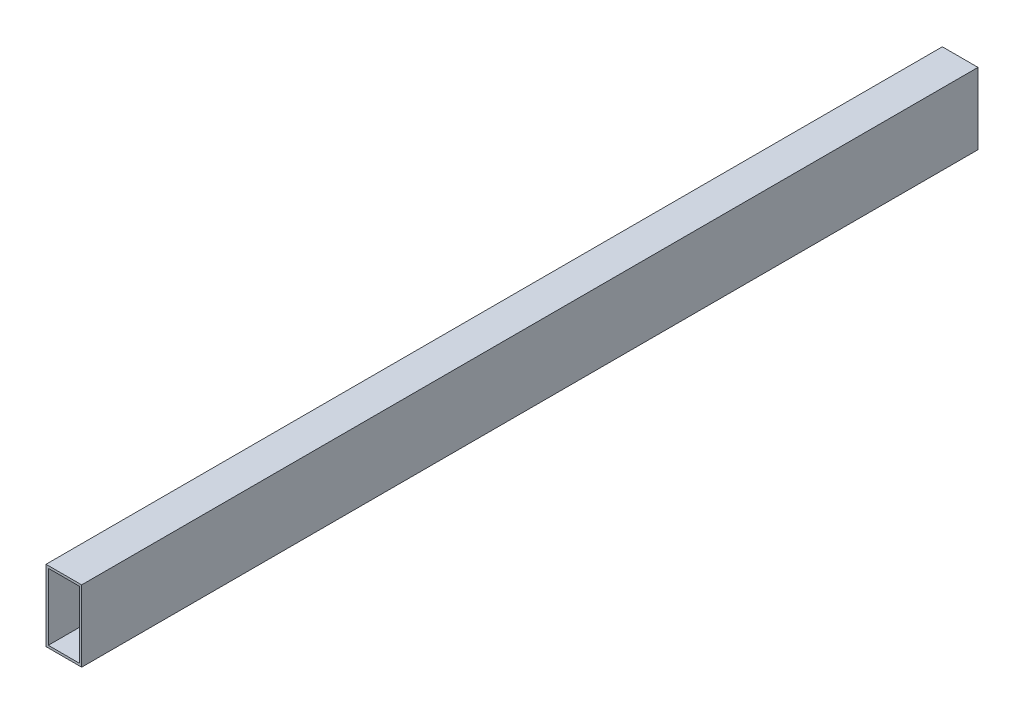
ISO-10303-21;
HEADER;
FILE_DESCRIPTION(('STEP AP214'),'2;1');
FILE_NAME('part.step','',(''),(''),'','','');
FILE_SCHEMA(('AUTOMOTIVE_DESIGN { 1 0 10303 214 1 1 1 1 }'));
ENDSEC;
DATA;
#1=APPLICATION_CONTEXT('core data for automotive mechanical design processes');
#2=APPLICATION_PROTOCOL_DEFINITION('international standard','automotive_design',2000,#1);
#3=PRODUCT_CONTEXT('',#1,'mechanical');
#4=PRODUCT('Part','Part','',(#3));
#5=PRODUCT_RELATED_PRODUCT_CATEGORY('part','',(#4));
#6=PRODUCT_DEFINITION_FORMATION('','',#4);
#7=PRODUCT_DEFINITION_CONTEXT('part definition',#1,'design');
#8=PRODUCT_DEFINITION('design','',#6,#7);
#9=PRODUCT_DEFINITION_SHAPE('','',#8);
#10=(LENGTH_UNIT() NAMED_UNIT(*) SI_UNIT(.MILLI.,.METRE.));
#11=(NAMED_UNIT(*) PLANE_ANGLE_UNIT() SI_UNIT($,.RADIAN.));
#12=(NAMED_UNIT(*) SI_UNIT($,.STERADIAN.) SOLID_ANGLE_UNIT());
#13=UNCERTAINTY_MEASURE_WITH_UNIT(LENGTH_MEASURE(1.E-05),#10,'distance_accuracy_value','');
#14=(GEOMETRIC_REPRESENTATION_CONTEXT(3) GLOBAL_UNCERTAINTY_ASSIGNED_CONTEXT((#13)) GLOBAL_UNIT_ASSIGNED_CONTEXT((#10,
#11,#12)) REPRESENTATION_CONTEXT('',''));
#15=CARTESIAN_POINT('',(0.,0.,0.));
#16=DIRECTION('',(0.,0.,1.));
#17=DIRECTION('',(1.,0.,0.));
#18=AXIS2_PLACEMENT_3D('',#15,#16,#17);
#19=CARTESIAN_POINT('',(-48.4372093023255,-30.1994186046511,638.302));
#20=DIRECTION('',(1.,0.,0.));
#21=DIRECTION('',(0.,0.,-1.));
#22=AXIS2_PLACEMENT_3D('',#19,#20,#21);
#23=PLANE('',#22);
#24=DIRECTION('',(0.,-1.,0.));
#25=VECTOR('',#24,1.);
#26=CARTESIAN_POINT('',(-48.4372093023255,-30.1994186046511,0.));
#27=LINE('',#26,#25);
#28=CARTESIAN_POINT('',(-48.4372093023255,20.6005813953489,0.));
#29=VERTEX_POINT('',#28);
#30=CARTESIAN_POINT('',(-48.4372093023255,-30.1994186046511,0.));
#31=VERTEX_POINT('',#30);
#32=EDGE_CURVE('E130',#29,#31,#27,.T.);
#33=ORIENTED_EDGE('',*,*,#32,.T.);
#34=DIRECTION('',(0.,0.,-1.));
#35=VECTOR('',#34,1.);
#36=CARTESIAN_POINT('',(-48.4372093023255,-30.1994186046511,638.302));
#37=LINE('',#36,#35);
#38=CARTESIAN_POINT('',(-48.4372093023255,-30.1994186046511,638.302));
#39=VERTEX_POINT('',#38);
#40=EDGE_CURVE('E11',#39,#31,#37,.T.);
#41=ORIENTED_EDGE('',*,*,#40,.F.);
#42=DIRECTION('',(0.,-1.,0.));
#43=VECTOR('',#42,1.);
#44=CARTESIAN_POINT('',(-48.4372093023255,-30.1994186046511,638.302));
#45=LINE('',#44,#43);
#46=CARTESIAN_POINT('',(-48.4372093023255,20.6005813953489,638.302));
#47=VERTEX_POINT('',#46);
#48=EDGE_CURVE('E134',#47,#39,#45,.T.);
#49=ORIENTED_EDGE('',*,*,#48,.F.);
#50=DIRECTION('',(0.,0.,-1.));
#51=VECTOR('',#50,1.);
#52=CARTESIAN_POINT('',(-48.4372093023255,20.6005813953489,638.302));
#53=LINE('',#52,#51);
#54=EDGE_CURVE('E144',#47,#29,#53,.T.);
#55=ORIENTED_EDGE('',*,*,#54,.T.);
#56=EDGE_LOOP('',(#33,#41,#49,#55));
#57=FACE_BOUND('',#56,.T.);
#58=ADVANCED_FACE('F33',(#57),#23,.F.);
#59=CARTESIAN_POINT('',(-48.4372093023255,-30.1994186046511,638.302));
#60=DIRECTION('',(0.,1.,0.));
#61=DIRECTION('',(0.,0.,1.));
#62=AXIS2_PLACEMENT_3D('',#59,#60,#61);
#63=PLANE('',#62);
#64=DIRECTION('',(1.,0.,0.));
#65=VECTOR('',#64,1.);
#66=CARTESIAN_POINT('',(-48.4372093023255,-30.1994186046511,0.));
#67=LINE('',#66,#65);
#68=CARTESIAN_POINT('',(-23.0372093023255,-30.1994186046511,0.));
#69=VERTEX_POINT('',#68);
#70=EDGE_CURVE('E147',#31,#69,#67,.T.);
#71=ORIENTED_EDGE('',*,*,#70,.T.);
#72=DIRECTION('',(0.,0.,-1.));
#73=VECTOR('',#72,1.);
#74=CARTESIAN_POINT('',(-23.0372093023255,-30.1994186046511,638.302));
#75=LINE('',#74,#73);
#76=CARTESIAN_POINT('',(-23.0372093023255,-30.1994186046511,638.302));
#77=VERTEX_POINT('',#76);
#78=EDGE_CURVE('E40',#77,#69,#75,.T.);
#79=ORIENTED_EDGE('',*,*,#78,.F.);
#80=DIRECTION('',(1.,0.,0.));
#81=VECTOR('',#80,1.);
#82=CARTESIAN_POINT('',(-48.4372093023255,-30.1994186046511,638.302));
#83=LINE('',#82,#81);
#84=EDGE_CURVE('E137',#39,#77,#83,.T.);
#85=ORIENTED_EDGE('',*,*,#84,.F.);
#86=ORIENTED_EDGE('',*,*,#40,.T.);
#87=EDGE_LOOP('',(#71,#79,#85,#86));
#88=FACE_BOUND('',#87,.T.);
#89=ADVANCED_FACE('F175',(#88),#63,.F.);
#90=CARTESIAN_POINT('',(-23.0372093023255,-30.1994186046511,638.302));
#91=DIRECTION('',(-1.,0.,0.));
#92=DIRECTION('',(0.,-1.,0.));
#93=AXIS2_PLACEMENT_3D('',#90,#91,#92);
#94=PLANE('',#93);
#95=DIRECTION('',(0.,1.,0.));
#96=VECTOR('',#95,1.);
#97=CARTESIAN_POINT('',(-23.0372093023255,-30.1994186046511,0.));
#98=LINE('',#97,#96);
#99=CARTESIAN_POINT('',(-23.0372093023255,20.6005813953489,0.));
#100=VERTEX_POINT('',#99);
#101=EDGE_CURVE('E149',#69,#100,#98,.T.);
#102=ORIENTED_EDGE('',*,*,#101,.T.);
#103=DIRECTION('',(0.,0.,-1.));
#104=VECTOR('',#103,1.);
#105=CARTESIAN_POINT('',(-23.0372093023255,20.6005813953489,638.302));
#106=LINE('',#105,#104);
#107=CARTESIAN_POINT('',(-23.0372093023255,20.6005813953489,638.302));
#108=VERTEX_POINT('',#107);
#109=EDGE_CURVE('E154',#108,#100,#106,.T.);
#110=ORIENTED_EDGE('',*,*,#109,.F.);
#111=DIRECTION('',(0.,1.,0.));
#112=VECTOR('',#111,1.);
#113=CARTESIAN_POINT('',(-23.0372093023255,-30.1994186046511,638.302));
#114=LINE('',#113,#112);
#115=EDGE_CURVE('E140',#77,#108,#114,.T.);
#116=ORIENTED_EDGE('',*,*,#115,.F.);
#117=ORIENTED_EDGE('',*,*,#78,.T.);
#118=EDGE_LOOP('',(#102,#110,#116,#117));
#119=FACE_BOUND('',#118,.T.);
#120=ADVANCED_FACE('F161',(#119),#94,.F.);
#121=CARTESIAN_POINT('',(-48.4372093023255,20.6005813953489,638.302));
#122=DIRECTION('',(0.,-1.,0.));
#123=DIRECTION('',(0.,0.,-1.));
#124=AXIS2_PLACEMENT_3D('',#121,#122,#123);
#125=PLANE('',#124);
#126=DIRECTION('',(-1.,0.,0.));
#127=VECTOR('',#126,1.);
#128=CARTESIAN_POINT('',(-48.4372093023255,20.6005813953489,0.));
#129=LINE('',#128,#127);
#130=EDGE_CURVE('E138',#100,#29,#129,.T.);
#131=ORIENTED_EDGE('',*,*,#130,.T.);
#132=ORIENTED_EDGE('',*,*,#54,.F.);
#133=DIRECTION('',(-1.,0.,0.));
#134=VECTOR('',#133,1.);
#135=CARTESIAN_POINT('',(-48.4372093023255,20.6005813953489,638.302));
#136=LINE('',#135,#134);
#137=EDGE_CURVE('E142',#108,#47,#136,.T.);
#138=ORIENTED_EDGE('',*,*,#137,.F.);
#139=ORIENTED_EDGE('',*,*,#109,.T.);
#140=EDGE_LOOP('',(#131,#132,#138,#139));
#141=FACE_BOUND('',#140,.T.);
#142=ADVANCED_FACE('F168',(#141),#125,.F.);
#143=CARTESIAN_POINT('',(0.,0.,638.302));
#144=DIRECTION('',(0.,0.,-1.));
#145=DIRECTION('',(-1.,0.,0.));
#146=AXIS2_PLACEMENT_3D('',#143,#144,#145);
#147=PLANE('',#146);
#148=DIRECTION('',(-1.,0.,0.));
#149=VECTOR('',#148,1.);
#150=CARTESIAN_POINT('',(-46.7862093023255,18.9495813953489,638.302));
#151=LINE('',#150,#149);
#152=CARTESIAN_POINT('',(-24.6882093023255,18.9495813953489,638.302));
#153=VERTEX_POINT('',#152);
#154=CARTESIAN_POINT('',(-46.7862093023255,18.9495813953489,638.302));
#155=VERTEX_POINT('',#154);
#156=EDGE_CURVE('E124',#153,#155,#151,.T.);
#157=ORIENTED_EDGE('',*,*,#156,.F.);
#158=DIRECTION('',(0.,1.,0.));
#159=VECTOR('',#158,1.);
#160=CARTESIAN_POINT('',(-24.6882093023255,18.9495813953489,638.302));
#161=LINE('',#160,#159);
#162=CARTESIAN_POINT('',(-24.6882093023255,-28.5484186046511,638.302));
#163=VERTEX_POINT('',#162);
#164=EDGE_CURVE('E47',#163,#153,#161,.T.);
#165=ORIENTED_EDGE('',*,*,#164,.F.);
#166=DIRECTION('',(1.,0.,0.));
#167=VECTOR('',#166,1.);
#168=CARTESIAN_POINT('',(-46.7862093023255,-28.5484186046511,638.302));
#169=LINE('',#168,#167);
#170=CARTESIAN_POINT('',(-46.7862093023255,-28.5484186046511,638.302));
#171=VERTEX_POINT('',#170);
#172=EDGE_CURVE('E115',#171,#163,#169,.T.);
#173=ORIENTED_EDGE('',*,*,#172,.F.);
#174=DIRECTION('',(0.,-1.,0.));
#175=VECTOR('',#174,1.);
#176=CARTESIAN_POINT('',(-46.7862093023255,18.9495813953489,638.302));
#177=LINE('',#176,#175);
#178=EDGE_CURVE('E118',#155,#171,#177,.T.);
#179=ORIENTED_EDGE('',*,*,#178,.F.);
#180=EDGE_LOOP('',(#157,#165,#173,#179));
#181=FACE_BOUND('',#180,.T.);
#182=ORIENTED_EDGE('',*,*,#48,.T.);
#183=ORIENTED_EDGE('',*,*,#84,.T.);
#184=ORIENTED_EDGE('',*,*,#115,.T.);
#185=ORIENTED_EDGE('',*,*,#137,.T.);
#186=EDGE_LOOP('',(#182,#183,#184,#185));
#187=FACE_BOUND('',#186,.T.);
#188=ADVANCED_FACE('F174',(#181,#187),#147,.F.);
#189=CARTESIAN_POINT('',(0.,0.,0.));
#190=DIRECTION('',(0.,0.,-1.));
#191=DIRECTION('',(-1.,0.,0.));
#192=AXIS2_PLACEMENT_3D('',#189,#190,#191);
#193=PLANE('',#192);
#194=DIRECTION('',(0.,1.,0.));
#195=VECTOR('',#194,1.);
#196=CARTESIAN_POINT('',(-24.6882093023255,18.9495813953489,0.));
#197=LINE('',#196,#195);
#198=CARTESIAN_POINT('',(-24.6882093023255,-28.5484186046511,0.));
#199=VERTEX_POINT('',#198);
#200=CARTESIAN_POINT('',(-24.6882093023255,18.9495813953489,0.));
#201=VERTEX_POINT('',#200);
#202=EDGE_CURVE('E99',#199,#201,#197,.T.);
#203=ORIENTED_EDGE('',*,*,#202,.T.);
#204=DIRECTION('',(-1.,0.,0.));
#205=VECTOR('',#204,1.);
#206=CARTESIAN_POINT('',(-46.7862093023255,18.9495813953489,0.));
#207=LINE('',#206,#205);
#208=CARTESIAN_POINT('',(-46.7862093023255,18.9495813953489,0.));
#209=VERTEX_POINT('',#208);
#210=EDGE_CURVE('E108',#201,#209,#207,.T.);
#211=ORIENTED_EDGE('',*,*,#210,.T.);
#212=DIRECTION('',(0.,-1.,0.));
#213=VECTOR('',#212,1.);
#214=CARTESIAN_POINT('',(-46.7862093023255,18.9495813953489,0.));
#215=LINE('',#214,#213);
#216=CARTESIAN_POINT('',(-46.7862093023255,-28.5484186046511,0.));
#217=VERTEX_POINT('',#216);
#218=EDGE_CURVE('E55',#209,#217,#215,.T.);
#219=ORIENTED_EDGE('',*,*,#218,.T.);
#220=DIRECTION('',(1.,0.,0.));
#221=VECTOR('',#220,1.);
#222=CARTESIAN_POINT('',(-46.7862093023255,-28.5484186046511,0.));
#223=LINE('',#222,#221);
#224=EDGE_CURVE('E105',#217,#199,#223,.T.);
#225=ORIENTED_EDGE('',*,*,#224,.T.);
#226=EDGE_LOOP('',(#203,#211,#219,#225));
#227=FACE_BOUND('',#226,.T.);
#228=ORIENTED_EDGE('',*,*,#32,.F.);
#229=ORIENTED_EDGE('',*,*,#130,.F.);
#230=ORIENTED_EDGE('',*,*,#101,.F.);
#231=ORIENTED_EDGE('',*,*,#70,.F.);
#232=EDGE_LOOP('',(#228,#229,#230,#231));
#233=FACE_BOUND('',#232,.T.);
#234=ADVANCED_FACE('F112',(#227,#233),#193,.T.);
#235=CARTESIAN_POINT('',(-24.6882093023255,18.9495813953489,0.));
#236=DIRECTION('',(1.,0.,0.));
#237=DIRECTION('',(0.,1.,0.));
#238=AXIS2_PLACEMENT_3D('',#235,#236,#237);
#239=PLANE('',#238);
#240=ORIENTED_EDGE('',*,*,#164,.T.);
#241=DIRECTION('',(0.,0.,1.));
#242=VECTOR('',#241,1.);
#243=CARTESIAN_POINT('',(-24.6882093023255,18.9495813953489,0.));
#244=LINE('',#243,#242);
#245=EDGE_CURVE('E95',#201,#153,#244,.T.);
#246=ORIENTED_EDGE('',*,*,#245,.F.);
#247=ORIENTED_EDGE('',*,*,#202,.F.);
#248=DIRECTION('',(0.,0.,1.));
#249=VECTOR('',#248,1.);
#250=CARTESIAN_POINT('',(-24.6882093023255,-28.5484186046511,0.));
#251=LINE('',#250,#249);
#252=EDGE_CURVE('E128',#199,#163,#251,.T.);
#253=ORIENTED_EDGE('',*,*,#252,.T.);
#254=EDGE_LOOP('',(#240,#246,#247,#253));
#255=FACE_BOUND('',#254,.T.);
#256=ADVANCED_FACE('F97',(#255),#239,.F.);
#257=CARTESIAN_POINT('',(-46.7862093023255,-28.5484186046511,0.));
#258=DIRECTION('',(0.,-1.,0.));
#259=DIRECTION('',(0.,0.,-1.));
#260=AXIS2_PLACEMENT_3D('',#257,#258,#259);
#261=PLANE('',#260);
#262=ORIENTED_EDGE('',*,*,#172,.T.);
#263=ORIENTED_EDGE('',*,*,#252,.F.);
#264=ORIENTED_EDGE('',*,*,#224,.F.);
#265=DIRECTION('',(0.,0.,1.));
#266=VECTOR('',#265,1.);
#267=CARTESIAN_POINT('',(-46.7862093023255,-28.5484186046511,0.));
#268=LINE('',#267,#266);
#269=EDGE_CURVE('E131',#217,#171,#268,.T.);
#270=ORIENTED_EDGE('',*,*,#269,.T.);
#271=EDGE_LOOP('',(#262,#263,#264,#270));
#272=FACE_BOUND('',#271,.T.);
#273=ADVANCED_FACE('F192',(#272),#261,.F.);
#274=CARTESIAN_POINT('',(-46.7862093023255,18.9495813953489,0.));
#275=DIRECTION('',(-1.,0.,0.));
#276=DIRECTION('',(0.,-1.,0.));
#277=AXIS2_PLACEMENT_3D('',#274,#275,#276);
#278=PLANE('',#277);
#279=ORIENTED_EDGE('',*,*,#178,.T.);
#280=ORIENTED_EDGE('',*,*,#269,.F.);
#281=ORIENTED_EDGE('',*,*,#218,.F.);
#282=DIRECTION('',(0.,0.,1.));
#283=VECTOR('',#282,1.);
#284=CARTESIAN_POINT('',(-46.7862093023255,18.9495813953489,0.));
#285=LINE('',#284,#283);
#286=EDGE_CURVE('E104',#209,#155,#285,.T.);
#287=ORIENTED_EDGE('',*,*,#286,.T.);
#288=EDGE_LOOP('',(#279,#280,#281,#287));
#289=FACE_BOUND('',#288,.T.);
#290=ADVANCED_FACE('F195',(#289),#278,.F.);
#291=CARTESIAN_POINT('',(-46.7862093023255,18.9495813953489,0.));
#292=DIRECTION('',(0.,1.,0.));
#293=DIRECTION('',(0.,0.,1.));
#294=AXIS2_PLACEMENT_3D('',#291,#292,#293);
#295=PLANE('',#294);
#296=ORIENTED_EDGE('',*,*,#156,.T.);
#297=ORIENTED_EDGE('',*,*,#286,.F.);
#298=ORIENTED_EDGE('',*,*,#210,.F.);
#299=ORIENTED_EDGE('',*,*,#245,.T.);
#300=EDGE_LOOP('',(#296,#297,#298,#299));
#301=FACE_BOUND('',#300,.T.);
#302=ADVANCED_FACE('F109',(#301),#295,.F.);
#303=CLOSED_SHELL('',(#58,#89,#120,#142,#188,#234,#256,#273,#290,#302));
#304=MANIFOLD_SOLID_BREP('B2',#303);
#305=ADVANCED_BREP_SHAPE_REPRESENTATION('',(#18,#304),#14);
#306=SHAPE_DEFINITION_REPRESENTATION(#9,#305);
ENDSEC;
END-ISO-10303-21;
